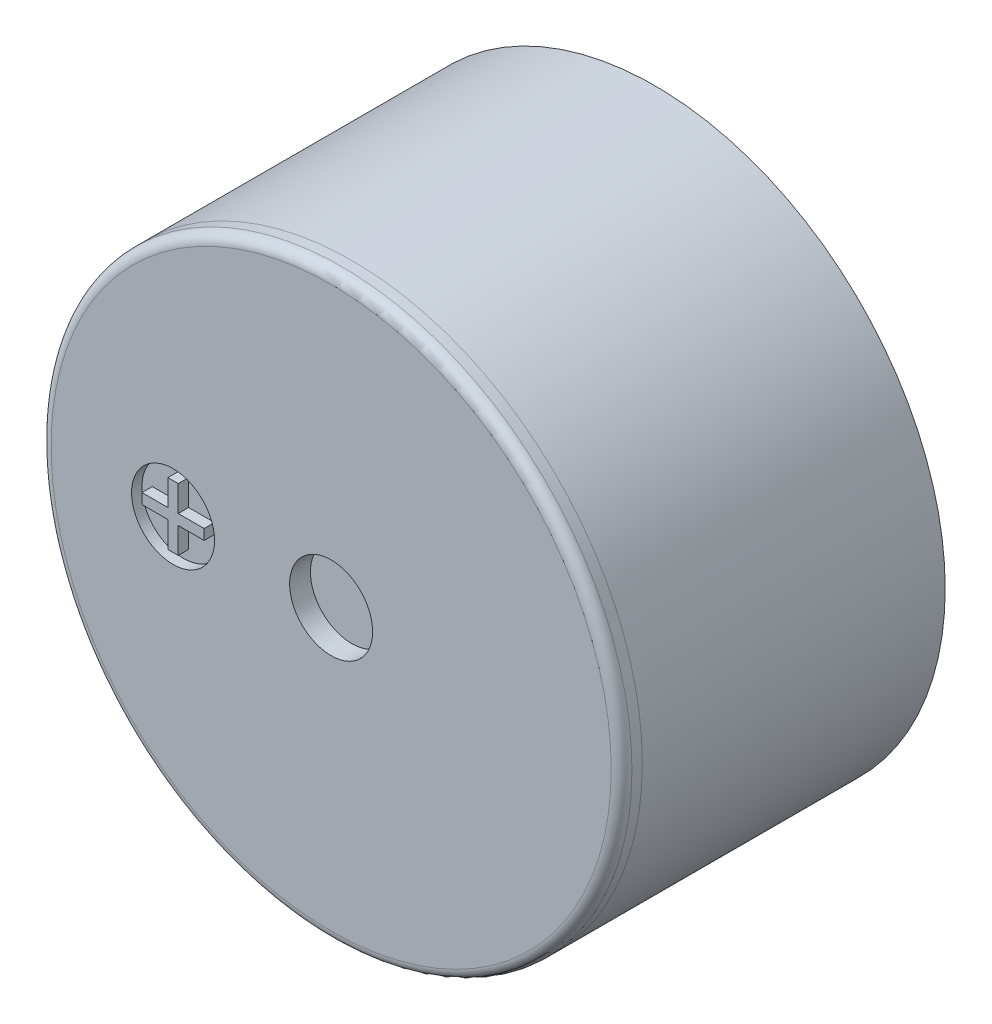
ISO-10303-21;
HEADER;
FILE_DESCRIPTION(('STEP AP214'),'2;1');
FILE_NAME('part.step','',(''),(''),'','','');
FILE_SCHEMA(('AUTOMOTIVE_DESIGN { 1 0 10303 214 1 1 1 1 }'));
ENDSEC;
DATA;
#1=APPLICATION_CONTEXT('core data for automotive mechanical design processes');
#2=APPLICATION_PROTOCOL_DEFINITION('international standard','automotive_design',2000,#1);
#3=PRODUCT_CONTEXT('',#1,'mechanical');
#4=PRODUCT('Part','Part','',(#3));
#5=PRODUCT_RELATED_PRODUCT_CATEGORY('part','',(#4));
#6=PRODUCT_DEFINITION_FORMATION('','',#4);
#7=PRODUCT_DEFINITION_CONTEXT('part definition',#1,'design');
#8=PRODUCT_DEFINITION('design','',#6,#7);
#9=PRODUCT_DEFINITION_SHAPE('','',#8);
#10=(LENGTH_UNIT() NAMED_UNIT(*) SI_UNIT(.MILLI.,.METRE.));
#11=(NAMED_UNIT(*) PLANE_ANGLE_UNIT() SI_UNIT($,.RADIAN.));
#12=(NAMED_UNIT(*) SI_UNIT($,.STERADIAN.) SOLID_ANGLE_UNIT());
#13=UNCERTAINTY_MEASURE_WITH_UNIT(LENGTH_MEASURE(1.E-05),#10,'distance_accuracy_value','');
#14=(GEOMETRIC_REPRESENTATION_CONTEXT(3) GLOBAL_UNCERTAINTY_ASSIGNED_CONTEXT((#13)) GLOBAL_UNIT_ASSIGNED_CONTEXT((#10,
#11,#12)) REPRESENTATION_CONTEXT('',''));
#15=CARTESIAN_POINT('',(0.,0.,0.));
#16=DIRECTION('',(0.,0.,1.));
#17=DIRECTION('',(1.,0.,0.));
#18=AXIS2_PLACEMENT_3D('',#15,#16,#17);
#19=CARTESIAN_POINT('',(0.,0.,5.));
#20=DIRECTION('',(0.,0.,1.));
#21=DIRECTION('',(1.,0.,0.));
#22=AXIS2_PLACEMENT_3D('',#19,#20,#21);
#23=PLANE('',#22);
#24=CARTESIAN_POINT('',(0.,0.,5.));
#25=DIRECTION('',(0.,0.,1.));
#26=DIRECTION('',(1.,0.,0.));
#27=AXIS2_PLACEMENT_3D('',#24,#25,#26);
#28=CIRCLE('',#27,6.5);
#29=CARTESIAN_POINT('',(6.5,0.,5.));
#30=VERTEX_POINT('',#29);
#31=EDGE_CURVE('P0_E11',#30,#30,#28,.T.);
#32=ORIENTED_EDGE('',*,*,#31,.F.);
#33=EDGE_LOOP('',(#32));
#34=FACE_BOUND('',#33,.T.);
#35=ADVANCED_FACE('P0_F17',(#34),#23,.F.);
#36=CARTESIAN_POINT('',(0.,0.,5.5));
#37=DIRECTION('',(0.,0.,1.));
#38=DIRECTION('',(1.,0.,0.));
#39=AXIS2_PLACEMENT_3D('',#36,#37,#38);
#40=PLANE('',#39);
#41=CARTESIAN_POINT('',(0.,0.,5.5));
#42=DIRECTION('',(0.,0.,1.));
#43=DIRECTION('',(1.,0.,0.));
#44=AXIS2_PLACEMENT_3D('',#41,#42,#43);
#45=CIRCLE('',#44,6.5);
#46=CARTESIAN_POINT('',(6.5,0.,5.5));
#47=VERTEX_POINT('',#46);
#48=EDGE_CURVE('P0_E20',#47,#47,#45,.T.);
#49=ORIENTED_EDGE('',*,*,#48,.T.);
#50=EDGE_LOOP('',(#49));
#51=FACE_BOUND('',#50,.T.);
#52=ADVANCED_FACE('P0_F45',(#51),#40,.T.);
#53=CARTESIAN_POINT('',(0.,0.,5.));
#54=DIRECTION('',(0.,0.,1.));
#55=DIRECTION('',(1.,0.,0.));
#56=AXIS2_PLACEMENT_3D('',#53,#54,#55);
#57=CYLINDRICAL_SURFACE('',#56,6.5);
#58=ORIENTED_EDGE('',*,*,#48,.F.);
#59=DIRECTION('',(0.,0.,1.));
#60=VECTOR('',#59,1.);
#61=CARTESIAN_POINT('',(6.5,0.,5.));
#62=LINE('',#61,#60);
#63=EDGE_CURVE('P0_E26',#30,#47,#62,.T.);
#64=ORIENTED_EDGE('',*,*,#63,.F.);
#65=ORIENTED_EDGE('',*,*,#31,.T.);
#66=ORIENTED_EDGE('',*,*,#63,.T.);
#67=EDGE_LOOP('',(#58,#64,#65,#66));
#68=FACE_BOUND('',#67,.T.);
#69=ADVANCED_FACE('P0_F41',(#68),#57,.T.);
#70=CLOSED_SHELL('',(#35,#52,#69));
#71=MANIFOLD_SOLID_BREP('P0_B1',#70);
#72=CARTESIAN_POINT('',(-3.81,0.,-2.));
#73=DIRECTION('',(0.,0.,1.));
#74=DIRECTION('',(1.,0.,0.));
#75=AXIS2_PLACEMENT_3D('',#72,#73,#74);
#76=PLANE('',#75);
#77=CARTESIAN_POINT('',(-3.81,0.,-2.));
#78=DIRECTION('',(0.,0.,1.));
#79=DIRECTION('',(1.,0.,0.));
#80=AXIS2_PLACEMENT_3D('',#77,#78,#79);
#81=CIRCLE('',#80,0.25);
#82=CARTESIAN_POINT('',(-3.56,0.,-2.));
#83=VERTEX_POINT('',#82);
#84=EDGE_CURVE('P1_E27',#83,#83,#81,.T.);
#85=ORIENTED_EDGE('',*,*,#84,.F.);
#86=EDGE_LOOP('',(#85));
#87=FACE_BOUND('',#86,.T.);
#88=ADVANCED_FACE('P1_F17',(#87),#76,.F.);
#89=CARTESIAN_POINT('',(-3.81,0.,0.5));
#90=DIRECTION('',(0.,0.,1.));
#91=DIRECTION('',(1.,0.,0.));
#92=AXIS2_PLACEMENT_3D('',#89,#90,#91);
#93=PLANE('',#92);
#94=CARTESIAN_POINT('',(-3.81,0.,0.5));
#95=DIRECTION('',(0.,0.,1.));
#96=DIRECTION('',(1.,0.,0.));
#97=AXIS2_PLACEMENT_3D('',#94,#95,#96);
#98=CIRCLE('',#97,0.35);
#99=CARTESIAN_POINT('',(-3.46,0.,0.5));
#100=VERTEX_POINT('',#99);
#101=EDGE_CURVE('P1_E53',#100,#100,#98,.T.);
#102=ORIENTED_EDGE('',*,*,#101,.T.);
#103=EDGE_LOOP('',(#102));
#104=FACE_BOUND('',#103,.T.);
#105=ADVANCED_FACE('P1_F19',(#104),#93,.T.);
#106=CARTESIAN_POINT('',(-3.81,0.,-1.9));
#107=DIRECTION('',(0.,0.,-1.));
#108=DIRECTION('',(1.,0.,0.));
#109=AXIS2_PLACEMENT_3D('',#106,#107,#108);
#110=TOROIDAL_SURFACE('',#109,0.25,0.1);
#111=ORIENTED_EDGE('',*,*,#84,.T.);
#112=CARTESIAN_POINT('',(-3.56,0.,-1.9));
#113=DIRECTION('',(0.,1.,0.));
#114=DIRECTION('',(1.,0.,0.));
#115=AXIS2_PLACEMENT_3D('',#112,#113,#114);
#116=CIRCLE('',#115,0.1);
#117=CARTESIAN_POINT('',(-3.46,0.,-1.9));
#118=VERTEX_POINT('',#117);
#119=EDGE_CURVE('P1_E11',#118,#83,#116,.T.);
#120=ORIENTED_EDGE('',*,*,#119,.F.);
#121=CARTESIAN_POINT('',(-3.81,0.,-1.9));
#122=DIRECTION('',(0.,0.,1.));
#123=DIRECTION('',(1.,0.,0.));
#124=AXIS2_PLACEMENT_3D('',#121,#122,#123);
#125=CIRCLE('',#124,0.35);
#126=EDGE_CURVE('P1_E44',#118,#118,#125,.T.);
#127=ORIENTED_EDGE('',*,*,#126,.F.);
#128=ORIENTED_EDGE('',*,*,#119,.T.);
#129=EDGE_LOOP('',(#111,#120,#127,#128));
#130=FACE_BOUND('',#129,.T.);
#131=ADVANCED_FACE('P1_F43',(#130),#110,.T.);
#132=CARTESIAN_POINT('',(-3.81,0.,-2.));
#133=DIRECTION('',(0.,0.,1.));
#134=DIRECTION('',(1.,0.,0.));
#135=AXIS2_PLACEMENT_3D('',#132,#133,#134);
#136=CYLINDRICAL_SURFACE('',#135,0.35);
#137=DIRECTION('',(0.,0.,1.));
#138=VECTOR('',#137,1.);
#139=CARTESIAN_POINT('',(-3.46,0.,-2.));
#140=LINE('',#139,#138);
#141=EDGE_CURVE('P1_E51',#118,#100,#140,.T.);
#142=ORIENTED_EDGE('',*,*,#141,.T.);
#143=ORIENTED_EDGE('',*,*,#101,.F.);
#144=ORIENTED_EDGE('',*,*,#141,.F.);
#145=ORIENTED_EDGE('',*,*,#126,.T.);
#146=EDGE_LOOP('',(#142,#143,#144,#145));
#147=FACE_BOUND('',#146,.T.);
#148=ADVANCED_FACE('P1_F49',(#147),#136,.T.);
#149=CLOSED_SHELL('',(#88,#105,#131,#148));
#150=MANIFOLD_SOLID_BREP('P1_B1',#149);
#151=CARTESIAN_POINT('',(3.81,0.,-2.));
#152=DIRECTION('',(0.,0.,1.));
#153=DIRECTION('',(1.,0.,0.));
#154=AXIS2_PLACEMENT_3D('',#151,#152,#153);
#155=PLANE('',#154);
#156=CARTESIAN_POINT('',(3.81,0.,-2.));
#157=DIRECTION('',(0.,0.,1.));
#158=DIRECTION('',(1.,0.,0.));
#159=AXIS2_PLACEMENT_3D('',#156,#157,#158);
#160=CIRCLE('',#159,0.25);
#161=CARTESIAN_POINT('',(4.06,0.,-2.));
#162=VERTEX_POINT('',#161);
#163=EDGE_CURVE('P2_E27',#162,#162,#160,.T.);
#164=ORIENTED_EDGE('',*,*,#163,.F.);
#165=EDGE_LOOP('',(#164));
#166=FACE_BOUND('',#165,.T.);
#167=ADVANCED_FACE('P2_F17',(#166),#155,.F.);
#168=CARTESIAN_POINT('',(3.81,0.,0.5));
#169=DIRECTION('',(0.,0.,1.));
#170=DIRECTION('',(1.,0.,0.));
#171=AXIS2_PLACEMENT_3D('',#168,#169,#170);
#172=PLANE('',#171);
#173=CARTESIAN_POINT('',(3.81,0.,0.5));
#174=DIRECTION('',(0.,0.,1.));
#175=DIRECTION('',(1.,0.,0.));
#176=AXIS2_PLACEMENT_3D('',#173,#174,#175);
#177=CIRCLE('',#176,0.35);
#178=CARTESIAN_POINT('',(4.16,0.,0.5));
#179=VERTEX_POINT('',#178);
#180=EDGE_CURVE('P2_E20',#179,#179,#177,.T.);
#181=ORIENTED_EDGE('',*,*,#180,.T.);
#182=EDGE_LOOP('',(#181));
#183=FACE_BOUND('',#182,.T.);
#184=ADVANCED_FACE('P2_F70',(#183),#172,.T.);
#185=CARTESIAN_POINT('',(3.81,0.,-1.9));
#186=DIRECTION('',(0.,0.,-1.));
#187=DIRECTION('',(1.,0.,0.));
#188=AXIS2_PLACEMENT_3D('',#185,#186,#187);
#189=TOROIDAL_SURFACE('',#188,0.25,0.1);
#190=ORIENTED_EDGE('',*,*,#163,.T.);
#191=CARTESIAN_POINT('',(4.06,0.,-1.9));
#192=DIRECTION('',(0.,1.,0.));
#193=DIRECTION('',(1.,0.,0.));
#194=AXIS2_PLACEMENT_3D('',#191,#192,#193);
#195=CIRCLE('',#194,0.1);
#196=CARTESIAN_POINT('',(4.16,0.,-1.9));
#197=VERTEX_POINT('',#196);
#198=EDGE_CURVE('P2_E11',#197,#162,#195,.T.);
#199=ORIENTED_EDGE('',*,*,#198,.F.);
#200=CARTESIAN_POINT('',(3.81,0.,-1.9));
#201=DIRECTION('',(0.,0.,1.));
#202=DIRECTION('',(1.,0.,0.));
#203=AXIS2_PLACEMENT_3D('',#200,#201,#202);
#204=CIRCLE('',#203,0.35);
#205=EDGE_CURVE('P2_E49',#197,#197,#204,.T.);
#206=ORIENTED_EDGE('',*,*,#205,.F.);
#207=ORIENTED_EDGE('',*,*,#198,.T.);
#208=EDGE_LOOP('',(#190,#199,#206,#207));
#209=FACE_BOUND('',#208,.T.);
#210=ADVANCED_FACE('P2_F48',(#209),#189,.T.);
#211=CARTESIAN_POINT('',(3.81,0.,-2.));
#212=DIRECTION('',(0.,0.,1.));
#213=DIRECTION('',(1.,0.,0.));
#214=AXIS2_PLACEMENT_3D('',#211,#212,#213);
#215=CYLINDRICAL_SURFACE('',#214,0.35);
#216=DIRECTION('',(0.,0.,1.));
#217=VECTOR('',#216,1.);
#218=CARTESIAN_POINT('',(4.16,0.,-2.));
#219=LINE('',#218,#217);
#220=EDGE_CURVE('P2_E55',#197,#179,#219,.T.);
#221=ORIENTED_EDGE('',*,*,#220,.T.);
#222=ORIENTED_EDGE('',*,*,#180,.F.);
#223=ORIENTED_EDGE('',*,*,#220,.F.);
#224=ORIENTED_EDGE('',*,*,#205,.T.);
#225=EDGE_LOOP('',(#221,#222,#223,#224));
#226=FACE_BOUND('',#225,.T.);
#227=ADVANCED_FACE('P2_F54',(#226),#215,.T.);
#228=CLOSED_SHELL('',(#167,#184,#210,#227));
#229=MANIFOLD_SOLID_BREP('P2_B1',#228);
#230=CARTESIAN_POINT('',(0.,0.,1.));
#231=DIRECTION('',(0.,0.,1.));
#232=DIRECTION('',(1.,0.,0.));
#233=AXIS2_PLACEMENT_3D('',#230,#231,#232);
#234=PLANE('',#233);
#235=CARTESIAN_POINT('',(0.,0.,1.));
#236=DIRECTION('',(0.,0.,1.));
#237=DIRECTION('',(1.,0.,0.));
#238=AXIS2_PLACEMENT_3D('',#235,#236,#237);
#239=CIRCLE('',#238,6.5);
#240=CARTESIAN_POINT('',(6.5,0.,1.));
#241=VERTEX_POINT('',#240);
#242=EDGE_CURVE('P3_E11',#241,#241,#239,.T.);
#243=ORIENTED_EDGE('',*,*,#242,.T.);
#244=EDGE_LOOP('',(#243));
#245=FACE_BOUND('',#244,.T.);
#246=ADVANCED_FACE('P3_F17',(#245),#234,.T.);
#247=CARTESIAN_POINT('',(0.,0.,7.8));
#248=DIRECTION('',(0.,0.,1.));
#249=DIRECTION('',(1.,0.,0.));
#250=AXIS2_PLACEMENT_3D('',#247,#248,#249);
#251=PLANE('',#250);
#252=DIRECTION('',(1.,0.,0.));
#253=VECTOR('',#252,1.);
#254=CARTESIAN_POINT('',(-4.56,0.125,7.8));
#255=LINE('',#254,#253);
#256=CARTESIAN_POINT('',(-4.56,0.125,7.8));
#257=VERTEX_POINT('',#256);
#258=CARTESIAN_POINT('',(-3.935,0.125,7.8));
#259=VERTEX_POINT('',#258);
#260=EDGE_CURVE('P3_E366',#257,#259,#255,.T.);
#261=ORIENTED_EDGE('',*,*,#260,.F.);
#262=DIRECTION('',(0.,1.,0.));
#263=VECTOR('',#262,1.);
#264=CARTESIAN_POINT('',(-4.56,-0.125,7.8));
#265=LINE('',#264,#263);
#266=CARTESIAN_POINT('',(-4.56,-0.125,7.8));
#267=VERTEX_POINT('',#266);
#268=EDGE_CURVE('P3_E269',#267,#257,#265,.T.);
#269=ORIENTED_EDGE('',*,*,#268,.F.);
#270=DIRECTION('',(1.,0.,0.));
#271=VECTOR('',#270,1.);
#272=CARTESIAN_POINT('',(-4.56,-0.125,7.8));
#273=LINE('',#272,#271);
#274=CARTESIAN_POINT('',(-3.935,-0.125,7.8));
#275=VERTEX_POINT('',#274);
#276=EDGE_CURVE('P3_E298',#267,#275,#273,.T.);
#277=ORIENTED_EDGE('',*,*,#276,.T.);
#278=DIRECTION('',(0.,1.,0.));
#279=VECTOR('',#278,1.);
#280=CARTESIAN_POINT('',(-3.935,-0.75,7.8));
#281=LINE('',#280,#279);
#282=CARTESIAN_POINT('',(-3.935,-0.75,7.8));
#283=VERTEX_POINT('',#282);
#284=EDGE_CURVE('P3_E284',#283,#275,#281,.T.);
#285=ORIENTED_EDGE('',*,*,#284,.F.);
#286=DIRECTION('',(-1.,0.,0.));
#287=VECTOR('',#286,1.);
#288=CARTESIAN_POINT('',(-3.685,-0.75,7.8));
#289=LINE('',#288,#287);
#290=CARTESIAN_POINT('',(-3.685,-0.75,7.8));
#291=VERTEX_POINT('',#290);
#292=EDGE_CURVE('P3_E280',#291,#283,#289,.T.);
#293=ORIENTED_EDGE('',*,*,#292,.F.);
#294=DIRECTION('',(0.,1.,0.));
#295=VECTOR('',#294,1.);
#296=CARTESIAN_POINT('',(-3.685,-0.75,7.8));
#297=LINE('',#296,#295);
#298=CARTESIAN_POINT('',(-3.685,-0.125,7.8));
#299=VERTEX_POINT('',#298);
#300=EDGE_CURVE('P3_E310',#291,#299,#297,.T.);
#301=ORIENTED_EDGE('',*,*,#300,.T.);
#302=DIRECTION('',(1.,0.,0.));
#303=VECTOR('',#302,1.);
#304=CARTESIAN_POINT('',(-4.56,-0.125,7.8));
#305=LINE('',#304,#303);
#306=CARTESIAN_POINT('',(-3.06,-0.125,7.8));
#307=VERTEX_POINT('',#306);
#308=EDGE_CURVE('P3_E250',#299,#307,#305,.T.);
#309=ORIENTED_EDGE('',*,*,#308,.T.);
#310=DIRECTION('',(0.,1.,0.));
#311=VECTOR('',#310,1.);
#312=CARTESIAN_POINT('',(-3.06,-0.125,7.8));
#313=LINE('',#312,#311);
#314=CARTESIAN_POINT('',(-3.06,0.125,7.8));
#315=VERTEX_POINT('',#314);
#316=EDGE_CURVE('P3_E208',#307,#315,#313,.T.);
#317=ORIENTED_EDGE('',*,*,#316,.T.);
#318=DIRECTION('',(1.,0.,0.));
#319=VECTOR('',#318,1.);
#320=CARTESIAN_POINT('',(-4.56,0.125,7.8));
#321=LINE('',#320,#319);
#322=CARTESIAN_POINT('',(-3.685,0.125,7.8));
#323=VERTEX_POINT('',#322);
#324=EDGE_CURVE('P3_E207',#323,#315,#321,.T.);
#325=ORIENTED_EDGE('',*,*,#324,.F.);
#326=DIRECTION('',(0.,1.,0.));
#327=VECTOR('',#326,1.);
#328=CARTESIAN_POINT('',(-3.685,-0.75,7.8));
#329=LINE('',#328,#327);
#330=CARTESIAN_POINT('',(-3.685,0.75,7.8));
#331=VERTEX_POINT('',#330);
#332=EDGE_CURVE('P3_E202',#323,#331,#329,.T.);
#333=ORIENTED_EDGE('',*,*,#332,.T.);
#334=DIRECTION('',(-1.,0.,0.));
#335=VECTOR('',#334,1.);
#336=CARTESIAN_POINT('',(-3.685,0.75,7.8));
#337=LINE('',#336,#335);
#338=CARTESIAN_POINT('',(-3.935,0.75,7.8));
#339=VERTEX_POINT('',#338);
#340=EDGE_CURVE('P3_E260',#331,#339,#337,.T.);
#341=ORIENTED_EDGE('',*,*,#340,.T.);
#342=DIRECTION('',(0.,1.,0.));
#343=VECTOR('',#342,1.);
#344=CARTESIAN_POINT('',(-3.935,-0.75,7.8));
#345=LINE('',#344,#343);
#346=EDGE_CURVE('P3_E342',#259,#339,#345,.T.);
#347=ORIENTED_EDGE('',*,*,#346,.F.);
#348=EDGE_LOOP('',(#261,#269,#277,#285,#293,#301,#309,#317,#325,#333,#341,#347));
#349=FACE_BOUND('',#348,.T.);
#350=ADVANCED_FACE('P3_F425',(#349),#251,.T.);
#351=CARTESIAN_POINT('',(0.,0.,0.));
#352=DIRECTION('',(0.,0.,1.));
#353=DIRECTION('',(1.,0.,0.));
#354=AXIS2_PLACEMENT_3D('',#351,#352,#353);
#355=CYLINDRICAL_SURFACE('',#354,6.5);
#356=DIRECTION('',(0.,0.,1.));
#357=VECTOR('',#356,1.);
#358=CARTESIAN_POINT('',(6.5,0.,0.));
#359=LINE('',#358,#357);
#360=CARTESIAN_POINT('',(6.5,0.,7.3));
#361=VERTEX_POINT('',#360);
#362=EDGE_CURVE('P3_E28',#241,#361,#359,.T.);
#363=ORIENTED_EDGE('',*,*,#362,.T.);
#364=CARTESIAN_POINT('',(0.,0.,7.3));
#365=DIRECTION('',(0.,0.,1.));
#366=DIRECTION('',(1.,0.,0.));
#367=AXIS2_PLACEMENT_3D('',#364,#365,#366);
#368=CIRCLE('',#367,6.5);
#369=EDGE_CURVE('P3_E273',#361,#361,#368,.T.);
#370=ORIENTED_EDGE('',*,*,#369,.T.);
#371=ORIENTED_EDGE('',*,*,#362,.F.);
#372=ORIENTED_EDGE('',*,*,#242,.F.);
#373=EDGE_LOOP('',(#363,#370,#371,#372));
#374=FACE_BOUND('',#373,.T.);
#375=ADVANCED_FACE('P3_F410',(#374),#355,.F.);
#376=CARTESIAN_POINT('',(-4.56,0.125,7.55));
#377=DIRECTION('',(0.,1.,0.));
#378=DIRECTION('',(1.,0.,0.));
#379=AXIS2_PLACEMENT_3D('',#376,#377,#378);
#380=PLANE('',#379);
#381=DIRECTION('',(1.,0.,0.));
#382=VECTOR('',#381,1.);
#383=CARTESIAN_POINT('',(-4.56,0.125,7.55));
#384=LINE('',#383,#382);
#385=CARTESIAN_POINT('',(-4.56,0.125,7.55));
#386=VERTEX_POINT('',#385);
#387=CARTESIAN_POINT('',(-3.935,0.125,7.55));
#388=VERTEX_POINT('',#387);
#389=EDGE_CURVE('P3_E242',#386,#388,#384,.T.);
#390=ORIENTED_EDGE('',*,*,#389,.F.);
#391=DIRECTION('',(0.,0.,1.));
#392=VECTOR('',#391,1.);
#393=CARTESIAN_POINT('',(-4.56,0.125,7.55));
#394=LINE('',#393,#392);
#395=EDGE_CURVE('P3_E272',#386,#257,#394,.T.);
#396=ORIENTED_EDGE('',*,*,#395,.T.);
#397=ORIENTED_EDGE('',*,*,#260,.T.);
#398=DIRECTION('',(0.,0.,1.));
#399=VECTOR('',#398,1.);
#400=CARTESIAN_POINT('',(-3.935,0.125,7.55));
#401=LINE('',#400,#399);
#402=EDGE_CURVE('P3_E169',#388,#259,#401,.T.);
#403=ORIENTED_EDGE('',*,*,#402,.F.);
#404=EDGE_LOOP('',(#390,#396,#397,#403));
#405=FACE_BOUND('',#404,.T.);
#406=ADVANCED_FACE('P3_F471',(#405),#380,.T.);
#407=CARTESIAN_POINT('',(-3.935,-0.75,7.55));
#408=DIRECTION('',(-1.,0.,0.));
#409=DIRECTION('',(0.,0.,1.));
#410=AXIS2_PLACEMENT_3D('',#407,#408,#409);
#411=PLANE('',#410);
#412=DIRECTION('',(0.,1.,0.));
#413=VECTOR('',#412,1.);
#414=CARTESIAN_POINT('',(-3.935,-0.75,7.55));
#415=LINE('',#414,#413);
#416=CARTESIAN_POINT('',(-3.935,0.75,7.55));
#417=VERTEX_POINT('',#416);
#418=EDGE_CURVE('P3_E232',#388,#417,#415,.T.);
#419=ORIENTED_EDGE('',*,*,#418,.F.);
#420=ORIENTED_EDGE('',*,*,#402,.T.);
#421=ORIENTED_EDGE('',*,*,#346,.T.);
#422=DIRECTION('',(0.,0.,1.));
#423=VECTOR('',#422,1.);
#424=CARTESIAN_POINT('',(-3.935,0.75,7.55));
#425=LINE('',#424,#423);
#426=EDGE_CURVE('P3_E156',#417,#339,#425,.T.);
#427=ORIENTED_EDGE('',*,*,#426,.F.);
#428=EDGE_LOOP('',(#419,#420,#421,#427));
#429=FACE_BOUND('',#428,.T.);
#430=ADVANCED_FACE('P3_F479',(#429),#411,.T.);
#431=CARTESIAN_POINT('',(-3.685,0.75,7.55));
#432=DIRECTION('',(0.,1.,0.));
#433=DIRECTION('',(1.,0.,0.));
#434=AXIS2_PLACEMENT_3D('',#431,#432,#433);
#435=PLANE('',#434);
#436=DIRECTION('',(0.,0.,1.));
#437=VECTOR('',#436,1.);
#438=CARTESIAN_POINT('',(-3.685,0.75,7.55));
#439=LINE('',#438,#437);
#440=CARTESIAN_POINT('',(-3.685,0.75,7.55));
#441=VERTEX_POINT('',#440);
#442=EDGE_CURVE('P3_E21',#441,#331,#439,.T.);
#443=ORIENTED_EDGE('',*,*,#442,.F.);
#444=DIRECTION('',(-1.,0.,0.));
#445=VECTOR('',#444,1.);
#446=CARTESIAN_POINT('',(-3.685,0.75,7.55));
#447=LINE('',#446,#445);
#448=EDGE_CURVE('P3_E225',#441,#417,#447,.T.);
#449=ORIENTED_EDGE('',*,*,#448,.T.);
#450=ORIENTED_EDGE('',*,*,#426,.T.);
#451=ORIENTED_EDGE('',*,*,#340,.F.);
#452=EDGE_LOOP('',(#443,#449,#450,#451));
#453=FACE_BOUND('',#452,.T.);
#454=ADVANCED_FACE('P3_F455',(#453),#435,.T.);
#455=CARTESIAN_POINT('',(-3.685,-0.75,7.55));
#456=DIRECTION('',(-1.,0.,0.));
#457=DIRECTION('',(0.,0.,1.));
#458=AXIS2_PLACEMENT_3D('',#455,#456,#457);
#459=PLANE('',#458);
#460=ORIENTED_EDGE('',*,*,#442,.T.);
#461=ORIENTED_EDGE('',*,*,#332,.F.);
#462=DIRECTION('',(0.,0.,1.));
#463=VECTOR('',#462,1.);
#464=CARTESIAN_POINT('',(-3.685,0.125,7.55));
#465=LINE('',#464,#463);
#466=CARTESIAN_POINT('',(-3.685,0.125,7.55));
#467=VERTEX_POINT('',#466);
#468=EDGE_CURVE('P3_E194',#467,#323,#465,.T.);
#469=ORIENTED_EDGE('',*,*,#468,.F.);
#470=DIRECTION('',(0.,1.,0.));
#471=VECTOR('',#470,1.);
#472=CARTESIAN_POINT('',(-3.685,-0.75,7.55));
#473=LINE('',#472,#471);
#474=EDGE_CURVE('P3_E199',#467,#441,#473,.T.);
#475=ORIENTED_EDGE('',*,*,#474,.T.);
#476=EDGE_LOOP('',(#460,#461,#469,#475));
#477=FACE_BOUND('',#476,.T.);
#478=ADVANCED_FACE('P3_F197',(#477),#459,.F.);
#479=CARTESIAN_POINT('',(-4.56,0.125,7.55));
#480=DIRECTION('',(0.,1.,0.));
#481=DIRECTION('',(1.,0.,0.));
#482=AXIS2_PLACEMENT_3D('',#479,#480,#481);
#483=PLANE('',#482);
#484=DIRECTION('',(1.,0.,0.));
#485=VECTOR('',#484,1.);
#486=CARTESIAN_POINT('',(-4.56,0.125,7.55));
#487=LINE('',#486,#485);
#488=CARTESIAN_POINT('',(-3.06,0.125,7.55));
#489=VERTEX_POINT('',#488);
#490=EDGE_CURVE('P3_E211',#467,#489,#487,.T.);
#491=ORIENTED_EDGE('',*,*,#490,.F.);
#492=ORIENTED_EDGE('',*,*,#468,.T.);
#493=ORIENTED_EDGE('',*,*,#324,.T.);
#494=DIRECTION('',(0.,0.,1.));
#495=VECTOR('',#494,1.);
#496=CARTESIAN_POINT('',(-3.06,0.125,7.55));
#497=LINE('',#496,#495);
#498=EDGE_CURVE('P3_E214',#489,#315,#497,.T.);
#499=ORIENTED_EDGE('',*,*,#498,.F.);
#500=EDGE_LOOP('',(#491,#492,#493,#499));
#501=FACE_BOUND('',#500,.T.);
#502=ADVANCED_FACE('P3_F212',(#501),#483,.T.);
#503=CARTESIAN_POINT('',(-3.06,-0.125,7.55));
#504=DIRECTION('',(1.,0.,0.));
#505=DIRECTION('',(0.,1.,0.));
#506=AXIS2_PLACEMENT_3D('',#503,#504,#505);
#507=PLANE('',#506);
#508=DIRECTION('',(0.,0.,1.));
#509=VECTOR('',#508,1.);
#510=CARTESIAN_POINT('',(-3.06,-0.125,7.55));
#511=LINE('',#510,#509);
#512=CARTESIAN_POINT('',(-3.06,-0.125,7.55));
#513=VERTEX_POINT('',#512);
#514=EDGE_CURVE('P3_E306',#513,#307,#511,.T.);
#515=ORIENTED_EDGE('',*,*,#514,.F.);
#516=DIRECTION('',(0.,1.,0.));
#517=VECTOR('',#516,1.);
#518=CARTESIAN_POINT('',(-3.06,-0.125,7.55));
#519=LINE('',#518,#517);
#520=EDGE_CURVE('P3_E219',#513,#489,#519,.T.);
#521=ORIENTED_EDGE('',*,*,#520,.T.);
#522=ORIENTED_EDGE('',*,*,#498,.T.);
#523=ORIENTED_EDGE('',*,*,#316,.F.);
#524=EDGE_LOOP('',(#515,#521,#522,#523));
#525=FACE_BOUND('',#524,.T.);
#526=ADVANCED_FACE('P3_F442',(#525),#507,.T.);
#527=CARTESIAN_POINT('',(-4.56,-0.125,7.55));
#528=DIRECTION('',(0.,1.,0.));
#529=DIRECTION('',(1.,0.,0.));
#530=AXIS2_PLACEMENT_3D('',#527,#528,#529);
#531=PLANE('',#530);
#532=ORIENTED_EDGE('',*,*,#514,.T.);
#533=ORIENTED_EDGE('',*,*,#308,.F.);
#534=DIRECTION('',(0.,0.,1.));
#535=VECTOR('',#534,1.);
#536=CARTESIAN_POINT('',(-3.685,-0.125,7.55));
#537=LINE('',#536,#535);
#538=CARTESIAN_POINT('',(-3.685,-0.125,7.55));
#539=VERTEX_POINT('',#538);
#540=EDGE_CURVE('P3_E343',#539,#299,#537,.T.);
#541=ORIENTED_EDGE('',*,*,#540,.F.);
#542=DIRECTION('',(1.,0.,0.));
#543=VECTOR('',#542,1.);
#544=CARTESIAN_POINT('',(-4.56,-0.125,7.55));
#545=LINE('',#544,#543);
#546=EDGE_CURVE('P3_E275',#539,#513,#545,.T.);
#547=ORIENTED_EDGE('',*,*,#546,.T.);
#548=EDGE_LOOP('',(#532,#533,#541,#547));
#549=FACE_BOUND('',#548,.T.);
#550=ADVANCED_FACE('P3_F445',(#549),#531,.F.);
#551=CARTESIAN_POINT('',(-3.685,-0.75,7.55));
#552=DIRECTION('',(-1.,0.,0.));
#553=DIRECTION('',(0.,0.,1.));
#554=AXIS2_PLACEMENT_3D('',#551,#552,#553);
#555=PLANE('',#554);
#556=ORIENTED_EDGE('',*,*,#540,.T.);
#557=ORIENTED_EDGE('',*,*,#300,.F.);
#558=DIRECTION('',(0.,0.,1.));
#559=VECTOR('',#558,1.);
#560=CARTESIAN_POINT('',(-3.685,-0.75,7.55));
#561=LINE('',#560,#559);
#562=CARTESIAN_POINT('',(-3.685,-0.75,7.55));
#563=VERTEX_POINT('',#562);
#564=EDGE_CURVE('P3_E283',#563,#291,#561,.T.);
#565=ORIENTED_EDGE('',*,*,#564,.F.);
#566=DIRECTION('',(0.,1.,0.));
#567=VECTOR('',#566,1.);
#568=CARTESIAN_POINT('',(-3.685,-0.75,7.55));
#569=LINE('',#568,#567);
#570=EDGE_CURVE('P3_E279',#563,#539,#569,.T.);
#571=ORIENTED_EDGE('',*,*,#570,.T.);
#572=EDGE_LOOP('',(#556,#557,#565,#571));
#573=FACE_BOUND('',#572,.T.);
#574=ADVANCED_FACE('P3_F464',(#573),#555,.F.);
#575=CARTESIAN_POINT('',(-3.685,-0.75,7.55));
#576=DIRECTION('',(0.,1.,0.));
#577=DIRECTION('',(1.,0.,0.));
#578=AXIS2_PLACEMENT_3D('',#575,#576,#577);
#579=PLANE('',#578);
#580=ORIENTED_EDGE('',*,*,#292,.T.);
#581=DIRECTION('',(0.,0.,1.));
#582=VECTOR('',#581,1.);
#583=CARTESIAN_POINT('',(-3.935,-0.75,7.55));
#584=LINE('',#583,#582);
#585=CARTESIAN_POINT('',(-3.935,-0.75,7.55));
#586=VERTEX_POINT('',#585);
#587=EDGE_CURVE('P3_E294',#586,#283,#584,.T.);
#588=ORIENTED_EDGE('',*,*,#587,.F.);
#589=DIRECTION('',(-1.,0.,0.));
#590=VECTOR('',#589,1.);
#591=CARTESIAN_POINT('',(-3.685,-0.75,7.55));
#592=LINE('',#591,#590);
#593=EDGE_CURVE('P3_E314',#563,#586,#592,.T.);
#594=ORIENTED_EDGE('',*,*,#593,.F.);
#595=ORIENTED_EDGE('',*,*,#564,.T.);
#596=EDGE_LOOP('',(#580,#588,#594,#595));
#597=FACE_BOUND('',#596,.T.);
#598=ADVANCED_FACE('P3_F460',(#597),#579,.F.);
#599=CARTESIAN_POINT('',(-3.935,-0.75,7.55));
#600=DIRECTION('',(-1.,0.,0.));
#601=DIRECTION('',(0.,0.,1.));
#602=AXIS2_PLACEMENT_3D('',#599,#600,#601);
#603=PLANE('',#602);
#604=DIRECTION('',(0.,1.,0.));
#605=VECTOR('',#604,1.);
#606=CARTESIAN_POINT('',(-3.935,-0.75,7.55));
#607=LINE('',#606,#605);
#608=CARTESIAN_POINT('',(-3.935,-0.125,7.55));
#609=VERTEX_POINT('',#608);
#610=EDGE_CURVE('P3_E317',#586,#609,#607,.T.);
#611=ORIENTED_EDGE('',*,*,#610,.F.);
#612=ORIENTED_EDGE('',*,*,#587,.T.);
#613=ORIENTED_EDGE('',*,*,#284,.T.);
#614=DIRECTION('',(0.,0.,1.));
#615=VECTOR('',#614,1.);
#616=CARTESIAN_POINT('',(-3.935,-0.125,7.55));
#617=LINE('',#616,#615);
#618=EDGE_CURVE('P3_E236',#609,#275,#617,.T.);
#619=ORIENTED_EDGE('',*,*,#618,.F.);
#620=EDGE_LOOP('',(#611,#612,#613,#619));
#621=FACE_BOUND('',#620,.T.);
#622=ADVANCED_FACE('P3_F456',(#621),#603,.T.);
#623=CARTESIAN_POINT('',(-4.56,-0.125,7.55));
#624=DIRECTION('',(0.,1.,0.));
#625=DIRECTION('',(1.,0.,0.));
#626=AXIS2_PLACEMENT_3D('',#623,#624,#625);
#627=PLANE('',#626);
#628=ORIENTED_EDGE('',*,*,#618,.T.);
#629=ORIENTED_EDGE('',*,*,#276,.F.);
#630=DIRECTION('',(0.,0.,1.));
#631=VECTOR('',#630,1.);
#632=CARTESIAN_POINT('',(-4.56,-0.125,7.55));
#633=LINE('',#632,#631);
#634=CARTESIAN_POINT('',(-4.56,-0.125,7.55));
#635=VERTEX_POINT('',#634);
#636=EDGE_CURVE('P3_E285',#635,#267,#633,.T.);
#637=ORIENTED_EDGE('',*,*,#636,.F.);
#638=DIRECTION('',(1.,0.,0.));
#639=VECTOR('',#638,1.);
#640=CARTESIAN_POINT('',(-4.56,-0.125,7.55));
#641=LINE('',#640,#639);
#642=EDGE_CURVE('P3_E324',#635,#609,#641,.T.);
#643=ORIENTED_EDGE('',*,*,#642,.T.);
#644=EDGE_LOOP('',(#628,#629,#637,#643));
#645=FACE_BOUND('',#644,.T.);
#646=ADVANCED_FACE('P3_F459',(#645),#627,.F.);
#647=CARTESIAN_POINT('',(-4.56,-0.125,7.55));
#648=DIRECTION('',(1.,0.,0.));
#649=DIRECTION('',(0.,1.,0.));
#650=AXIS2_PLACEMENT_3D('',#647,#648,#649);
#651=PLANE('',#650);
#652=ORIENTED_EDGE('',*,*,#268,.T.);
#653=ORIENTED_EDGE('',*,*,#395,.F.);
#654=DIRECTION('',(0.,1.,0.));
#655=VECTOR('',#654,1.);
#656=CARTESIAN_POINT('',(-4.56,-0.125,7.55));
#657=LINE('',#656,#655);
#658=EDGE_CURVE('P3_E246',#635,#386,#657,.T.);
#659=ORIENTED_EDGE('',*,*,#658,.F.);
#660=ORIENTED_EDGE('',*,*,#636,.T.);
#661=EDGE_LOOP('',(#652,#653,#659,#660));
#662=FACE_BOUND('',#661,.T.);
#663=ADVANCED_FACE('P3_F422',(#662),#651,.F.);
#664=CARTESIAN_POINT('',(0.,0.,0.5));
#665=DIRECTION('',(0.,0.,1.));
#666=DIRECTION('',(1.,0.,0.));
#667=AXIS2_PLACEMENT_3D('',#664,#665,#666);
#668=PLANE('',#667);
#669=CARTESIAN_POINT('',(0.,0.,0.5));
#670=DIRECTION('',(0.,0.,1.));
#671=DIRECTION('',(1.,0.,0.));
#672=AXIS2_PLACEMENT_3D('',#669,#670,#671);
#673=CIRCLE('',#672,6.5);
#674=CARTESIAN_POINT('',(6.5,0.,0.5));
#675=VERTEX_POINT('',#674);
#676=EDGE_CURVE('P3_E256',#675,#675,#673,.T.);
#677=ORIENTED_EDGE('',*,*,#676,.F.);
#678=EDGE_LOOP('',(#677));
#679=FACE_BOUND('',#678,.T.);
#680=ADVANCED_FACE('P3_F413',(#679),#668,.F.);
#681=CARTESIAN_POINT('',(0.,0.,7.3));
#682=DIRECTION('',(0.,0.,1.));
#683=DIRECTION('',(1.,0.,0.));
#684=AXIS2_PLACEMENT_3D('',#681,#682,#683);
#685=PLANE('',#684);
#686=CARTESIAN_POINT('',(0.,0.,7.3));
#687=DIRECTION('',(0.,0.,1.));
#688=DIRECTION('',(1.,0.,0.));
#689=AXIS2_PLACEMENT_3D('',#686,#687,#688);
#690=CIRCLE('',#689,1.);
#691=CARTESIAN_POINT('',(1.,0.,7.3));
#692=VERTEX_POINT('',#691);
#693=EDGE_CURVE('P3_E238',#692,#692,#690,.T.);
#694=ORIENTED_EDGE('',*,*,#693,.T.);
#695=EDGE_LOOP('',(#694));
#696=FACE_BOUND('',#695,.T.);
#697=ORIENTED_EDGE('',*,*,#369,.F.);
#698=EDGE_LOOP('',(#697));
#699=FACE_BOUND('',#698,.T.);
#700=ADVANCED_FACE('P3_F19',(#696,#699),#685,.F.);
#701=CARTESIAN_POINT('',(-3.81,0.,7.55));
#702=DIRECTION('',(0.,0.,1.));
#703=DIRECTION('',(1.,0.,0.));
#704=AXIS2_PLACEMENT_3D('',#701,#702,#703);
#705=PLANE('',#704);
#706=ORIENTED_EDGE('',*,*,#658,.T.);
#707=ORIENTED_EDGE('',*,*,#389,.T.);
#708=ORIENTED_EDGE('',*,*,#418,.T.);
#709=ORIENTED_EDGE('',*,*,#448,.F.);
#710=ORIENTED_EDGE('',*,*,#474,.F.);
#711=ORIENTED_EDGE('',*,*,#490,.T.);
#712=ORIENTED_EDGE('',*,*,#520,.F.);
#713=ORIENTED_EDGE('',*,*,#546,.F.);
#714=ORIENTED_EDGE('',*,*,#570,.F.);
#715=ORIENTED_EDGE('',*,*,#593,.T.);
#716=ORIENTED_EDGE('',*,*,#610,.T.);
#717=ORIENTED_EDGE('',*,*,#642,.F.);
#718=EDGE_LOOP('',(#706,#707,#708,#709,#710,#711,#712,#713,#714,#715,#716,#717));
#719=FACE_BOUND('',#718,.T.);
#720=CARTESIAN_POINT('',(-3.81,0.,7.55));
#721=DIRECTION('',(0.,0.,1.));
#722=DIRECTION('',(1.,0.,0.));
#723=AXIS2_PLACEMENT_3D('',#720,#721,#722);
#724=CIRCLE('',#723,1.);
#725=CARTESIAN_POINT('',(-2.81,0.,7.55));
#726=VERTEX_POINT('',#725);
#727=EDGE_CURVE('P3_E299',#726,#726,#724,.T.);
#728=ORIENTED_EDGE('',*,*,#727,.T.);
#729=EDGE_LOOP('',(#728));
#730=FACE_BOUND('',#729,.T.);
#731=ADVANCED_FACE('P3_F222',(#719,#730),#705,.T.);
#732=CARTESIAN_POINT('',(0.,0.,0.));
#733=DIRECTION('',(0.,0.,1.));
#734=DIRECTION('',(1.,0.,0.));
#735=AXIS2_PLACEMENT_3D('',#732,#733,#734);
#736=CYLINDRICAL_SURFACE('',#735,6.5);
#737=DIRECTION('',(0.,0.,1.));
#738=VECTOR('',#737,1.);
#739=CARTESIAN_POINT('',(6.5,0.,0.));
#740=LINE('',#739,#738);
#741=CARTESIAN_POINT('',(6.5,0.,0.));
#742=VERTEX_POINT('',#741);
#743=EDGE_CURVE('P3_E252',#742,#675,#740,.T.);
#744=ORIENTED_EDGE('',*,*,#743,.T.);
#745=ORIENTED_EDGE('',*,*,#676,.T.);
#746=ORIENTED_EDGE('',*,*,#743,.F.);
#747=CARTESIAN_POINT('',(0.,0.,0.));
#748=DIRECTION('',(0.,0.,1.));
#749=DIRECTION('',(1.,0.,0.));
#750=AXIS2_PLACEMENT_3D('',#747,#748,#749);
#751=CIRCLE('',#750,6.5);
#752=EDGE_CURVE('P3_E303',#742,#742,#751,.T.);
#753=ORIENTED_EDGE('',*,*,#752,.F.);
#754=EDGE_LOOP('',(#744,#745,#746,#753));
#755=FACE_BOUND('',#754,.T.);
#756=ADVANCED_FACE('P3_F420',(#755),#736,.F.);
#757=CARTESIAN_POINT('',(0.,0.,7.3));
#758=DIRECTION('',(0.,0.,1.));
#759=DIRECTION('',(1.,0.,0.));
#760=AXIS2_PLACEMENT_3D('',#757,#758,#759);
#761=CYLINDRICAL_SURFACE('',#760,1.);
#762=ORIENTED_EDGE('',*,*,#693,.F.);
#763=DIRECTION('',(0.,0.,1.));
#764=VECTOR('',#763,1.);
#765=CARTESIAN_POINT('',(1.,0.,7.3));
#766=LINE('',#765,#764);
#767=CARTESIAN_POINT('',(1.,0.,7.8));
#768=VERTEX_POINT('',#767);
#769=EDGE_CURVE('P3_E241',#692,#768,#766,.T.);
#770=ORIENTED_EDGE('',*,*,#769,.T.);
#771=CARTESIAN_POINT('',(0.,0.,7.8));
#772=DIRECTION('',(0.,0.,1.));
#773=DIRECTION('',(1.,0.,0.));
#774=AXIS2_PLACEMENT_3D('',#771,#772,#773);
#775=CIRCLE('',#774,1.);
#776=EDGE_CURVE('P3_E349',#768,#768,#775,.T.);
#777=ORIENTED_EDGE('',*,*,#776,.T.);
#778=ORIENTED_EDGE('',*,*,#769,.F.);
#779=EDGE_LOOP('',(#762,#770,#777,#778));
#780=FACE_BOUND('',#779,.T.);
#781=ADVANCED_FACE('P3_F440',(#780),#761,.F.);
#782=CARTESIAN_POINT('',(-3.81,0.,7.55));
#783=DIRECTION('',(0.,0.,1.));
#784=DIRECTION('',(1.,0.,0.));
#785=AXIS2_PLACEMENT_3D('',#782,#783,#784);
#786=CYLINDRICAL_SURFACE('',#785,1.);
#787=ORIENTED_EDGE('',*,*,#727,.F.);
#788=DIRECTION('',(0.,0.,1.));
#789=VECTOR('',#788,1.);
#790=CARTESIAN_POINT('',(-2.81,0.,7.55));
#791=LINE('',#790,#789);
#792=CARTESIAN_POINT('',(-2.81,0.,7.8));
#793=VERTEX_POINT('',#792);
#794=EDGE_CURVE('P3_E143',#726,#793,#791,.T.);
#795=ORIENTED_EDGE('',*,*,#794,.T.);
#796=CARTESIAN_POINT('',(-3.81,0.,7.8));
#797=DIRECTION('',(0.,0.,1.));
#798=DIRECTION('',(1.,0.,0.));
#799=AXIS2_PLACEMENT_3D('',#796,#797,#798);
#800=CIRCLE('',#799,1.);
#801=EDGE_CURVE('P3_E347',#793,#793,#800,.T.);
#802=ORIENTED_EDGE('',*,*,#801,.T.);
#803=ORIENTED_EDGE('',*,*,#794,.F.);
#804=EDGE_LOOP('',(#787,#795,#802,#803));
#805=FACE_BOUND('',#804,.T.);
#806=ADVANCED_FACE('P3_F466',(#805),#786,.F.);
#807=CARTESIAN_POINT('',(0.,0.,0.));
#808=DIRECTION('',(0.,0.,1.));
#809=DIRECTION('',(1.,0.,0.));
#810=AXIS2_PLACEMENT_3D('',#807,#808,#809);
#811=PLANE('',#810);
#812=ORIENTED_EDGE('',*,*,#752,.T.);
#813=EDGE_LOOP('',(#812));
#814=FACE_BOUND('',#813,.T.);
#815=CARTESIAN_POINT('',(0.,0.,0.));
#816=DIRECTION('',(0.,0.,1.));
#817=DIRECTION('',(1.,0.,0.));
#818=AXIS2_PLACEMENT_3D('',#815,#816,#817);
#819=CIRCLE('',#818,7.);
#820=CARTESIAN_POINT('',(7.,0.,0.));
#821=VERTEX_POINT('',#820);
#822=EDGE_CURVE('P3_E132',#821,#821,#819,.T.);
#823=ORIENTED_EDGE('',*,*,#822,.F.);
#824=EDGE_LOOP('',(#823));
#825=FACE_BOUND('',#824,.T.);
#826=ADVANCED_FACE('P3_F451',(#814,#825),#811,.F.);
#827=CARTESIAN_POINT('',(0.,0.,7.8));
#828=DIRECTION('',(0.,0.,1.));
#829=DIRECTION('',(1.,0.,0.));
#830=AXIS2_PLACEMENT_3D('',#827,#828,#829);
#831=PLANE('',#830);
#832=ORIENTED_EDGE('',*,*,#776,.F.);
#833=EDGE_LOOP('',(#832));
#834=FACE_BOUND('',#833,.T.);
#835=ORIENTED_EDGE('',*,*,#801,.F.);
#836=EDGE_LOOP('',(#835));
#837=FACE_BOUND('',#836,.T.);
#838=CARTESIAN_POINT('',(0.,0.,7.8));
#839=DIRECTION('',(0.,0.,1.));
#840=DIRECTION('',(1.,0.,0.));
#841=AXIS2_PLACEMENT_3D('',#838,#839,#840);
#842=CIRCLE('',#841,6.75);
#843=CARTESIAN_POINT('',(6.75,0.,7.8));
#844=VERTEX_POINT('',#843);
#845=EDGE_CURVE('P3_E264',#844,#844,#842,.T.);
#846=ORIENTED_EDGE('',*,*,#845,.T.);
#847=EDGE_LOOP('',(#846));
#848=FACE_BOUND('',#847,.T.);
#849=ADVANCED_FACE('P3_F447',(#834,#837,#848),#831,.T.);
#850=CARTESIAN_POINT('',(0.,0.,0.));
#851=DIRECTION('',(0.,0.,1.));
#852=DIRECTION('',(1.,0.,0.));
#853=AXIS2_PLACEMENT_3D('',#850,#851,#852);
#854=CYLINDRICAL_SURFACE('',#853,7.);
#855=DIRECTION('',(0.,0.,1.));
#856=VECTOR('',#855,1.);
#857=CARTESIAN_POINT('',(7.,0.,0.));
#858=LINE('',#857,#856);
#859=CARTESIAN_POINT('',(7.,0.,7.3));
#860=VERTEX_POINT('',#859);
#861=EDGE_CURVE('P3_E267',#821,#860,#858,.T.);
#862=ORIENTED_EDGE('',*,*,#861,.T.);
#863=CARTESIAN_POINT('',(0.,0.,7.3));
#864=DIRECTION('',(0.,0.,1.));
#865=DIRECTION('',(1.,0.,0.));
#866=AXIS2_PLACEMENT_3D('',#863,#864,#865);
#867=CIRCLE('',#866,7.);
#868=EDGE_CURVE('P3_E378',#860,#860,#867,.T.);
#869=ORIENTED_EDGE('',*,*,#868,.F.);
#870=ORIENTED_EDGE('',*,*,#861,.F.);
#871=ORIENTED_EDGE('',*,*,#822,.T.);
#872=EDGE_LOOP('',(#862,#869,#870,#871));
#873=FACE_BOUND('',#872,.T.);
#874=ADVANCED_FACE('P3_F450',(#873),#854,.T.);
#875=CARTESIAN_POINT('',(0.,0.,7.55));
#876=DIRECTION('',(0.,0.,1.));
#877=DIRECTION('',(1.,0.,0.));
#878=AXIS2_PLACEMENT_3D('',#875,#876,#877);
#879=TOROIDAL_SURFACE('',#878,6.75,0.25);
#880=CARTESIAN_POINT('',(6.75,0.,7.55));
#881=DIRECTION('',(0.,-1.,0.));
#882=DIRECTION('',(1.,0.,0.));
#883=AXIS2_PLACEMENT_3D('',#880,#881,#882);
#884=CIRCLE('',#883,0.25);
#885=CARTESIAN_POINT('',(7.,0.,7.55));
#886=VERTEX_POINT('',#885);
#887=EDGE_CURVE('P3_E268',#886,#844,#884,.T.);
#888=ORIENTED_EDGE('',*,*,#887,.F.);
#889=CARTESIAN_POINT('',(0.,0.,7.55));
#890=DIRECTION('',(0.,0.,1.));
#891=DIRECTION('',(1.,0.,0.));
#892=AXIS2_PLACEMENT_3D('',#889,#890,#891);
#893=CIRCLE('',#892,7.);
#894=EDGE_CURVE('P3_E375',#886,#886,#893,.T.);
#895=ORIENTED_EDGE('',*,*,#894,.T.);
#896=ORIENTED_EDGE('',*,*,#887,.T.);
#897=ORIENTED_EDGE('',*,*,#845,.F.);
#898=EDGE_LOOP('',(#888,#895,#896,#897));
#899=FACE_BOUND('',#898,.T.);
#900=ADVANCED_FACE('P3_F433',(#899),#879,.T.);
#901=CARTESIAN_POINT('',(0.,0.,7.3));
#902=DIRECTION('',(0.,0.,1.));
#903=DIRECTION('',(1.,0.,0.));
#904=AXIS2_PLACEMENT_3D('',#901,#902,#903);
#905=CYLINDRICAL_SURFACE('',#904,7.);
#906=DIRECTION('',(0.,0.,1.));
#907=VECTOR('',#906,1.);
#908=CARTESIAN_POINT('',(7.,0.,7.3));
#909=LINE('',#908,#907);
#910=EDGE_CURVE('P3_E379',#860,#886,#909,.T.);
#911=ORIENTED_EDGE('',*,*,#910,.T.);
#912=ORIENTED_EDGE('',*,*,#894,.F.);
#913=ORIENTED_EDGE('',*,*,#910,.F.);
#914=ORIENTED_EDGE('',*,*,#868,.T.);
#915=EDGE_LOOP('',(#911,#912,#913,#914));
#916=FACE_BOUND('',#915,.T.);
#917=ADVANCED_FACE('P3_F387',(#916),#905,.T.);
#918=CLOSED_SHELL('',(#246,#350,#375,#406,#430,#454,#478,#502,#526,#550,#574,#598,#622,#646,
#663,#680,#700,#731,#756,#781,#806,#826,#849,#874,#900,#917));
#919=MANIFOLD_SOLID_BREP('P3_B1',#918);
#920=ADVANCED_BREP_SHAPE_REPRESENTATION('',(#18,#71,#150,#229,#919),#14);
#921=SHAPE_DEFINITION_REPRESENTATION(#9,#920);
ENDSEC;
END-ISO-10303-21;
